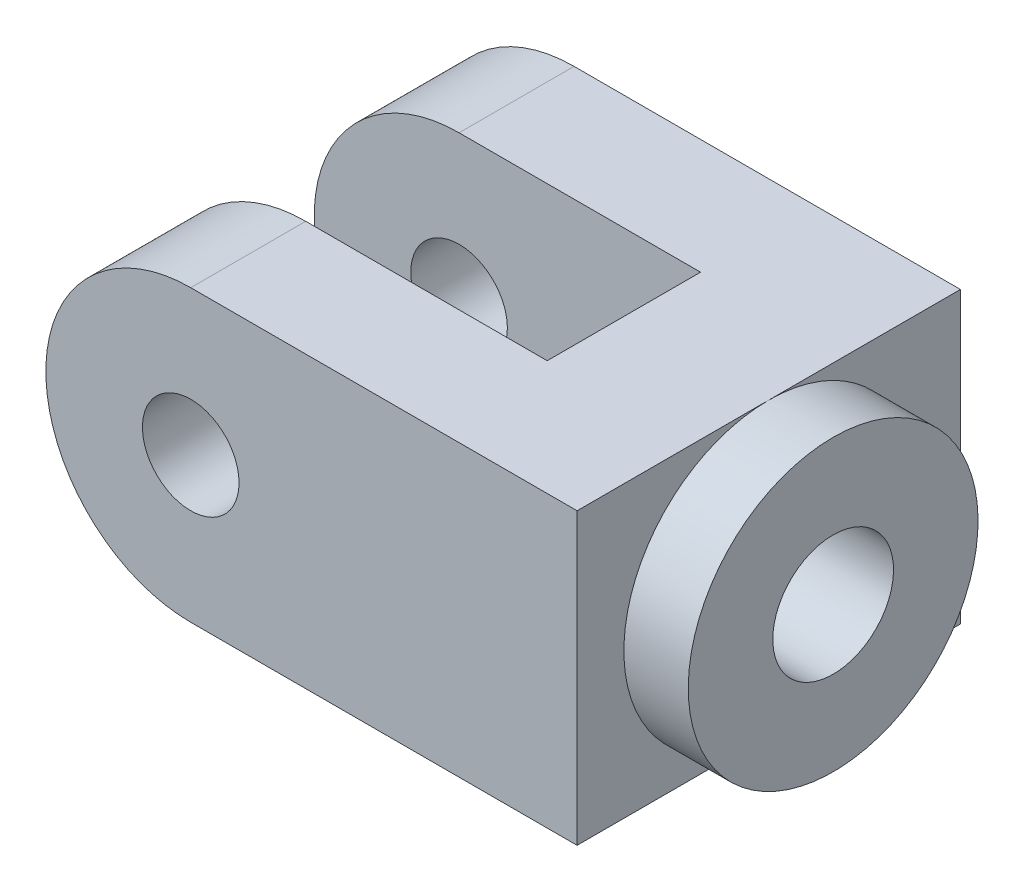
ISO-10303-21;
HEADER;
FILE_DESCRIPTION(('STEP AP214'),'2;1');
FILE_NAME('part.step','',(''),(''),'','','');
FILE_SCHEMA(('AUTOMOTIVE_DESIGN { 1 0 10303 214 1 1 1 1 }'));
ENDSEC;
DATA;
#1=APPLICATION_CONTEXT('core data for automotive mechanical design processes');
#2=APPLICATION_PROTOCOL_DEFINITION('international standard','automotive_design',2000,#1);
#3=PRODUCT_CONTEXT('',#1,'mechanical');
#4=PRODUCT('Part','Part','',(#3));
#5=PRODUCT_RELATED_PRODUCT_CATEGORY('part','',(#4));
#6=PRODUCT_DEFINITION_FORMATION('','',#4);
#7=PRODUCT_DEFINITION_CONTEXT('part definition',#1,'design');
#8=PRODUCT_DEFINITION('design','',#6,#7);
#9=PRODUCT_DEFINITION_SHAPE('','',#8);
#10=(LENGTH_UNIT() NAMED_UNIT(*) SI_UNIT(.MILLI.,.METRE.));
#11=(NAMED_UNIT(*) PLANE_ANGLE_UNIT() SI_UNIT($,.RADIAN.));
#12=(NAMED_UNIT(*) SI_UNIT($,.STERADIAN.) SOLID_ANGLE_UNIT());
#13=UNCERTAINTY_MEASURE_WITH_UNIT(LENGTH_MEASURE(1.E-05),#10,'distance_accuracy_value','');
#14=(GEOMETRIC_REPRESENTATION_CONTEXT(3) GLOBAL_UNCERTAINTY_ASSIGNED_CONTEXT((#13)) GLOBAL_UNIT_ASSIGNED_CONTEXT((#10,
#11,#12)) REPRESENTATION_CONTEXT('',''));
#15=CARTESIAN_POINT('',(0.,0.,0.));
#16=DIRECTION('',(0.,0.,1.));
#17=DIRECTION('',(1.,0.,0.));
#18=AXIS2_PLACEMENT_3D('',#15,#16,#17);
#19=CARTESIAN_POINT('',(33.8277041829736,12.5928,16.659225));
#20=DIRECTION('',(-1.,0.,0.));
#21=DIRECTION('',(0.,-1.,0.));
#22=AXIS2_PLACEMENT_3D('',#19,#20,#21);
#23=PLANE('',#22);
#24=CARTESIAN_POINT('',(33.8277041829736,0.,0.));
#25=DIRECTION('',(1.,0.,0.));
#26=DIRECTION('',(0.,1.,0.));
#27=AXIS2_PLACEMENT_3D('',#24,#25,#26);
#28=CIRCLE('',#27,12.5928);
#29=CARTESIAN_POINT('',(33.8277041829736,12.5928,0.));
#30=VERTEX_POINT('',#29);
#31=CARTESIAN_POINT('',(33.8277041829736,-12.5928,0.));
#32=VERTEX_POINT('',#31);
#33=EDGE_CURVE('E50',#30,#32,#28,.T.);
#34=ORIENTED_EDGE('',*,*,#33,.F.);
#35=DIRECTION('',(0.,0.,-1.));
#36=VECTOR('',#35,1.);
#37=CARTESIAN_POINT('',(33.8277041829736,12.5928,16.659225));
#38=LINE('',#37,#36);
#39=CARTESIAN_POINT('',(33.8277041829736,12.5928,16.659225));
#40=VERTEX_POINT('',#39);
#41=EDGE_CURVE('E112',#40,#30,#38,.T.);
#42=ORIENTED_EDGE('',*,*,#41,.F.);
#43=DIRECTION('',(0.,1.,0.));
#44=VECTOR('',#43,1.);
#45=CARTESIAN_POINT('',(33.8277041829736,12.5928,16.659225));
#46=LINE('',#45,#44);
#47=CARTESIAN_POINT('',(33.8277041829736,-12.5928,16.659225));
#48=VERTEX_POINT('',#47);
#49=EDGE_CURVE('E262',#48,#40,#46,.T.);
#50=ORIENTED_EDGE('',*,*,#49,.F.);
#51=DIRECTION('',(0.,0.,-1.));
#52=VECTOR('',#51,1.);
#53=CARTESIAN_POINT('',(33.8277041829736,-12.5928,16.659225));
#54=LINE('',#53,#52);
#55=EDGE_CURVE('E132',#48,#32,#54,.T.);
#56=ORIENTED_EDGE('',*,*,#55,.T.);
#57=EDGE_LOOP('',(#34,#42,#50,#56));
#58=FACE_BOUND('',#57,.T.);
#59=ADVANCED_FACE('F38',(#58),#23,.F.);
#60=CARTESIAN_POINT('',(0.246904182973619,0.,136.133565343694));
#61=DIRECTION('',(0.,0.,-1.));
#62=DIRECTION('',(-1.,0.,0.));
#63=AXIS2_PLACEMENT_3D('',#60,#61,#62);
#64=CYLINDRICAL_SURFACE('',#63,12.5928);
#65=DIRECTION('',(0.,0.,-1.));
#66=VECTOR('',#65,1.);
#67=CARTESIAN_POINT('',(0.246904182973616,12.5928,136.133565343694));
#68=LINE('',#67,#66);
#69=CARTESIAN_POINT('',(0.246904182973616,12.5928,16.659225));
#70=VERTEX_POINT('',#69);
#71=CARTESIAN_POINT('',(0.246904182973622,12.5928,6.66369));
#72=VERTEX_POINT('',#71);
#73=EDGE_CURVE('E256',#70,#72,#68,.T.);
#74=ORIENTED_EDGE('',*,*,#73,.T.);
#75=CARTESIAN_POINT('',(0.246904182973619,0.,6.66369));
#76=DIRECTION('',(0.,0.,1.));
#77=DIRECTION('',(1.,0.,0.));
#78=AXIS2_PLACEMENT_3D('',#75,#76,#77);
#79=CIRCLE('',#78,12.5928);
#80=CARTESIAN_POINT('',(0.24690348143056,-12.5928,6.66369));
#81=VERTEX_POINT('',#80);
#82=EDGE_CURVE('E48',#72,#81,#79,.T.);
#83=ORIENTED_EDGE('',*,*,#82,.T.);
#84=DIRECTION('',(0.,0.,-1.));
#85=VECTOR('',#84,1.);
#86=CARTESIAN_POINT('',(0.24690348143056,-12.5928,136.133565343694));
#87=LINE('',#86,#85);
#88=CARTESIAN_POINT('',(0.24690348143056,-12.5928,16.659225));
#89=VERTEX_POINT('',#88);
#90=EDGE_CURVE('E251',#89,#81,#87,.T.);
#91=ORIENTED_EDGE('',*,*,#90,.F.);
#92=CARTESIAN_POINT('',(0.246904182973619,0.,16.659225));
#93=DIRECTION('',(0.,0.,1.));
#94=DIRECTION('',(1.,0.,0.));
#95=AXIS2_PLACEMENT_3D('',#92,#93,#94);
#96=CIRCLE('',#95,12.5928);
#97=EDGE_CURVE('E254',#89,#70,#96,.F.);
#98=ORIENTED_EDGE('',*,*,#97,.T.);
#99=EDGE_LOOP('',(#74,#83,#91,#98));
#100=FACE_BOUND('',#99,.T.);
#101=ADVANCED_FACE('F159',(#100),#64,.T.);
#102=CARTESIAN_POINT('',(-12.3458958170264,-12.5928,16.659225));
#103=DIRECTION('',(0.,1.,0.));
#104=DIRECTION('',(0.,0.,1.));
#105=AXIS2_PLACEMENT_3D('',#102,#103,#104);
#106=PLANE('',#105);
#107=ORIENTED_EDGE('',*,*,#90,.T.);
#108=DIRECTION('',(1.,0.,0.));
#109=VECTOR('',#108,1.);
#110=CARTESIAN_POINT('',(-12.3458958170264,-12.5928,6.66369));
#111=LINE('',#110,#109);
#112=CARTESIAN_POINT('',(21.2349041829736,-12.5928,6.66369));
#113=VERTEX_POINT('',#112);
#114=EDGE_CURVE('E243',#81,#113,#111,.T.);
#115=ORIENTED_EDGE('',*,*,#114,.T.);
#116=DIRECTION('',(0.,0.,-1.));
#117=VECTOR('',#116,1.);
#118=CARTESIAN_POINT('',(21.2349041829736,-12.5928,16.659225));
#119=LINE('',#118,#117);
#120=CARTESIAN_POINT('',(21.2349041829736,-12.5928,-6.66369000000001));
#121=VERTEX_POINT('',#120);
#122=EDGE_CURVE('E247',#113,#121,#119,.T.);
#123=ORIENTED_EDGE('',*,*,#122,.T.);
#124=DIRECTION('',(-1.,0.,0.));
#125=VECTOR('',#124,1.);
#126=CARTESIAN_POINT('',(-12.3458958170264,-12.5928,-6.66369));
#127=LINE('',#126,#125);
#128=CARTESIAN_POINT('',(0.24690348143056,-12.5928,-6.66369000000001));
#129=VERTEX_POINT('',#128);
#130=EDGE_CURVE('E237',#121,#129,#127,.T.);
#131=ORIENTED_EDGE('',*,*,#130,.T.);
#132=CARTESIAN_POINT('',(0.24690348143056,-12.5928,-16.659225));
#133=VERTEX_POINT('',#132);
#134=EDGE_CURVE('E255',#129,#133,#87,.T.);
#135=ORIENTED_EDGE('',*,*,#134,.T.);
#136=DIRECTION('',(1.,0.,0.));
#137=VECTOR('',#136,1.);
#138=CARTESIAN_POINT('',(-12.3458958170264,-12.5928,-16.659225));
#139=LINE('',#138,#137);
#140=CARTESIAN_POINT('',(33.8277041829736,-12.5928,-16.659225));
#141=VERTEX_POINT('',#140);
#142=EDGE_CURVE('E265',#133,#141,#139,.T.);
#143=ORIENTED_EDGE('',*,*,#142,.T.);
#144=EDGE_CURVE('E271',#32,#141,#54,.T.);
#145=ORIENTED_EDGE('',*,*,#144,.F.);
#146=ORIENTED_EDGE('',*,*,#55,.F.);
#147=DIRECTION('',(1.,0.,0.));
#148=VECTOR('',#147,1.);
#149=CARTESIAN_POINT('',(-12.3458958170264,-12.5928,16.659225));
#150=LINE('',#149,#148);
#151=EDGE_CURVE('E268',#89,#48,#150,.T.);
#152=ORIENTED_EDGE('',*,*,#151,.F.);
#153=EDGE_LOOP('',(#107,#115,#123,#131,#135,#143,#145,#146,#152));
#154=FACE_BOUND('',#153,.T.);
#155=ADVANCED_FACE('F163',(#154),#106,.F.);
#156=EDGE_CURVE('E11',#32,#30,#28,.T.);
#157=ORIENTED_EDGE('',*,*,#156,.F.);
#158=ORIENTED_EDGE('',*,*,#144,.T.);
#159=DIRECTION('',(0.,1.,0.));
#160=VECTOR('',#159,1.);
#161=CARTESIAN_POINT('',(33.8277041829736,12.5928,-16.659225));
#162=LINE('',#161,#160);
#163=CARTESIAN_POINT('',(33.8277041829736,12.5928,-16.659225));
#164=VERTEX_POINT('',#163);
#165=EDGE_CURVE('E130',#141,#164,#162,.T.);
#166=ORIENTED_EDGE('',*,*,#165,.T.);
#167=EDGE_CURVE('E116',#30,#164,#38,.T.);
#168=ORIENTED_EDGE('',*,*,#167,.F.);
#169=EDGE_LOOP('',(#157,#158,#166,#168));
#170=FACE_BOUND('',#169,.T.);
#171=ADVANCED_FACE('F40',(#170),#23,.F.);
#172=CARTESIAN_POINT('',(-12.3458958170264,12.5928,16.659225));
#173=DIRECTION('',(0.,-1.,0.));
#174=DIRECTION('',(0.,0.,-1.));
#175=AXIS2_PLACEMENT_3D('',#172,#173,#174);
#176=PLANE('',#175);
#177=DIRECTION('',(0.,0.,-1.));
#178=VECTOR('',#177,1.);
#179=CARTESIAN_POINT('',(21.2349041829736,12.5928,-6.66369000000001));
#180=LINE('',#179,#178);
#181=CARTESIAN_POINT('',(21.2349041829736,12.5928,6.66369));
#182=VERTEX_POINT('',#181);
#183=CARTESIAN_POINT('',(21.2349041829736,12.5928,-6.66369000000001));
#184=VERTEX_POINT('',#183);
#185=EDGE_CURVE('E221',#182,#184,#180,.T.);
#186=ORIENTED_EDGE('',*,*,#185,.F.);
#187=DIRECTION('',(1.,0.,0.));
#188=VECTOR('',#187,1.);
#189=CARTESIAN_POINT('',(21.2349041829736,12.5928,6.66369));
#190=LINE('',#189,#188);
#191=EDGE_CURVE('E229',#72,#182,#190,.T.);
#192=ORIENTED_EDGE('',*,*,#191,.F.);
#193=ORIENTED_EDGE('',*,*,#73,.F.);
#194=DIRECTION('',(-1.,0.,0.));
#195=VECTOR('',#194,1.);
#196=CARTESIAN_POINT('',(-12.3458958170264,12.5928,16.659225));
#197=LINE('',#196,#195);
#198=EDGE_CURVE('E120',#40,#70,#197,.T.);
#199=ORIENTED_EDGE('',*,*,#198,.F.);
#200=ORIENTED_EDGE('',*,*,#41,.T.);
#201=ORIENTED_EDGE('',*,*,#167,.T.);
#202=DIRECTION('',(-1.,0.,0.));
#203=VECTOR('',#202,1.);
#204=CARTESIAN_POINT('',(-12.3458958170264,12.5928,-16.659225));
#205=LINE('',#204,#203);
#206=CARTESIAN_POINT('',(0.246904182973619,12.5928,-16.659225));
#207=VERTEX_POINT('',#206);
#208=EDGE_CURVE('E274',#164,#207,#205,.T.);
#209=ORIENTED_EDGE('',*,*,#208,.T.);
#210=CARTESIAN_POINT('',(0.246904182973623,12.5928,-6.66369));
#211=VERTEX_POINT('',#210);
#212=EDGE_CURVE('E63',#211,#207,#68,.T.);
#213=ORIENTED_EDGE('',*,*,#212,.F.);
#214=DIRECTION('',(-1.,0.,0.));
#215=VECTOR('',#214,1.);
#216=CARTESIAN_POINT('',(21.2349041829736,12.5928,-6.66369000000001));
#217=LINE('',#216,#215);
#218=EDGE_CURVE('E225',#184,#211,#217,.T.);
#219=ORIENTED_EDGE('',*,*,#218,.F.);
#220=EDGE_LOOP('',(#186,#192,#193,#199,#200,#201,#209,#213,#219));
#221=FACE_BOUND('',#220,.T.);
#222=ADVANCED_FACE('F114',(#221),#176,.F.);
#223=CARTESIAN_POINT('',(10.7409041829736,0.,16.659225));
#224=DIRECTION('',(0.,0.,1.));
#225=DIRECTION('',(1.,0.,0.));
#226=AXIS2_PLACEMENT_3D('',#223,#224,#225);
#227=PLANE('',#226);
#228=CARTESIAN_POINT('',(0.246904182973619,0.,16.659225));
#229=DIRECTION('',(0.,0.,1.));
#230=DIRECTION('',(1.,0.,0.));
#231=AXIS2_PLACEMENT_3D('',#228,#229,#230);
#232=CIRCLE('',#231,4.1976);
#233=CARTESIAN_POINT('',(4.44450418297362,0.,16.659225));
#234=VERTEX_POINT('',#233);
#235=EDGE_CURVE('E210',#234,#234,#232,.T.);
#236=ORIENTED_EDGE('',*,*,#235,.F.);
#237=EDGE_LOOP('',(#236));
#238=FACE_BOUND('',#237,.T.);
#239=ORIENTED_EDGE('',*,*,#97,.F.);
#240=ORIENTED_EDGE('',*,*,#151,.T.);
#241=ORIENTED_EDGE('',*,*,#49,.T.);
#242=ORIENTED_EDGE('',*,*,#198,.T.);
#243=EDGE_LOOP('',(#239,#240,#241,#242));
#244=FACE_BOUND('',#243,.T.);
#245=ADVANCED_FACE('F172',(#238,#244),#227,.T.);
#246=CARTESIAN_POINT('',(10.7409041829736,0.,-16.659225));
#247=DIRECTION('',(0.,0.,1.));
#248=DIRECTION('',(1.,0.,0.));
#249=AXIS2_PLACEMENT_3D('',#246,#247,#248);
#250=PLANE('',#249);
#251=CARTESIAN_POINT('',(0.246904182973619,0.,-16.659225));
#252=DIRECTION('',(0.,0.,1.));
#253=DIRECTION('',(1.,0.,0.));
#254=AXIS2_PLACEMENT_3D('',#251,#252,#253);
#255=CIRCLE('',#254,4.1976);
#256=CARTESIAN_POINT('',(4.44450418297362,0.,-16.659225));
#257=VERTEX_POINT('',#256);
#258=EDGE_CURVE('E309',#257,#257,#255,.T.);
#259=ORIENTED_EDGE('',*,*,#258,.T.);
#260=EDGE_LOOP('',(#259));
#261=FACE_BOUND('',#260,.T.);
#262=ORIENTED_EDGE('',*,*,#142,.F.);
#263=CARTESIAN_POINT('',(0.246904182973619,0.,-16.659225));
#264=DIRECTION('',(0.,0.,1.));
#265=DIRECTION('',(1.,0.,0.));
#266=AXIS2_PLACEMENT_3D('',#263,#264,#265);
#267=CIRCLE('',#266,12.5928);
#268=EDGE_CURVE('E126',#133,#207,#267,.F.);
#269=ORIENTED_EDGE('',*,*,#268,.T.);
#270=ORIENTED_EDGE('',*,*,#208,.F.);
#271=ORIENTED_EDGE('',*,*,#165,.F.);
#272=EDGE_LOOP('',(#262,#269,#270,#271));
#273=FACE_BOUND('',#272,.T.);
#274=ADVANCED_FACE('F179',(#261,#273),#250,.F.);
#275=CARTESIAN_POINT('',(0.246904182973619,0.,-6.66369000000001));
#276=DIRECTION('',(0.,0.,-1.));
#277=DIRECTION('',(-1.,0.,0.));
#278=AXIS2_PLACEMENT_3D('',#275,#276,#277);
#279=CIRCLE('',#278,12.5928);
#280=EDGE_CURVE('E284',#129,#211,#279,.T.);
#281=ORIENTED_EDGE('',*,*,#280,.T.);
#282=ORIENTED_EDGE('',*,*,#212,.T.);
#283=ORIENTED_EDGE('',*,*,#268,.F.);
#284=ORIENTED_EDGE('',*,*,#134,.F.);
#285=EDGE_LOOP('',(#281,#282,#283,#284));
#286=FACE_BOUND('',#285,.T.);
#287=ADVANCED_FACE('F166',(#286),#64,.T.);
#288=CARTESIAN_POINT('',(21.2349041829736,-17.22765,-6.66369000000001));
#289=DIRECTION('',(1.,0.,0.));
#290=DIRECTION('',(0.,0.,-1.));
#291=AXIS2_PLACEMENT_3D('',#288,#289,#290);
#292=PLANE('',#291);
#293=CARTESIAN_POINT('',(21.2349041829736,0.,0.));
#294=DIRECTION('',(1.,0.,0.));
#295=DIRECTION('',(0.,0.,-1.));
#296=AXIS2_PLACEMENT_3D('',#293,#294,#295);
#297=CIRCLE('',#296,5.247);
#298=CARTESIAN_POINT('',(21.2349041829736,5.247,0.));
#299=VERTEX_POINT('',#298);
#300=EDGE_CURVE('E205',#299,#299,#297,.T.);
#301=ORIENTED_EDGE('',*,*,#300,.T.);
#302=EDGE_LOOP('',(#301));
#303=FACE_BOUND('',#302,.T.);
#304=DIRECTION('',(0.,1.,0.));
#305=VECTOR('',#304,1.);
#306=CARTESIAN_POINT('',(21.2349041829736,-17.22765,6.66369));
#307=LINE('',#306,#305);
#308=EDGE_CURVE('E234',#113,#182,#307,.T.);
#309=ORIENTED_EDGE('',*,*,#308,.T.);
#310=ORIENTED_EDGE('',*,*,#185,.T.);
#311=DIRECTION('',(0.,1.,0.));
#312=VECTOR('',#311,1.);
#313=CARTESIAN_POINT('',(21.2349041829736,-17.22765,-6.66369000000001));
#314=LINE('',#313,#312);
#315=EDGE_CURVE('E233',#121,#184,#314,.T.);
#316=ORIENTED_EDGE('',*,*,#315,.F.);
#317=ORIENTED_EDGE('',*,*,#122,.F.);
#318=EDGE_LOOP('',(#309,#310,#316,#317));
#319=FACE_BOUND('',#318,.T.);
#320=ADVANCED_FACE('F187',(#303,#319),#292,.F.);
#321=CARTESIAN_POINT('',(21.2349041829736,-17.22765,6.66369));
#322=DIRECTION('',(0.,0.,1.));
#323=DIRECTION('',(1.,0.,0.));
#324=AXIS2_PLACEMENT_3D('',#321,#322,#323);
#325=PLANE('',#324);
#326=CARTESIAN_POINT('',(0.246904182973619,0.,6.66368999999999));
#327=DIRECTION('',(0.,0.,1.));
#328=DIRECTION('',(1.,0.,0.));
#329=AXIS2_PLACEMENT_3D('',#326,#327,#328);
#330=CIRCLE('',#329,4.1976);
#331=CARTESIAN_POINT('',(4.44450418297362,0.,6.66368999999999));
#332=VERTEX_POINT('',#331);
#333=EDGE_CURVE('E214',#332,#332,#330,.T.);
#334=ORIENTED_EDGE('',*,*,#333,.T.);
#335=EDGE_LOOP('',(#334));
#336=FACE_BOUND('',#335,.T.);
#337=ORIENTED_EDGE('',*,*,#82,.F.);
#338=ORIENTED_EDGE('',*,*,#191,.T.);
#339=ORIENTED_EDGE('',*,*,#308,.F.);
#340=ORIENTED_EDGE('',*,*,#114,.F.);
#341=EDGE_LOOP('',(#337,#338,#339,#340));
#342=FACE_BOUND('',#341,.T.);
#343=ADVANCED_FACE('F190',(#336,#342),#325,.F.);
#344=CARTESIAN_POINT('',(21.2349041829736,-17.22765,-6.66369000000001));
#345=DIRECTION('',(0.,0.,-1.));
#346=DIRECTION('',(-1.,0.,0.));
#347=AXIS2_PLACEMENT_3D('',#344,#345,#346);
#348=PLANE('',#347);
#349=CARTESIAN_POINT('',(0.246904182973619,0.,-6.66369));
#350=DIRECTION('',(0.,0.,-1.));
#351=DIRECTION('',(-1.,0.,0.));
#352=AXIS2_PLACEMENT_3D('',#349,#350,#351);
#353=CIRCLE('',#352,4.1976);
#354=CARTESIAN_POINT('',(-3.95069581702638,0.,-6.66369));
#355=VERTEX_POINT('',#354);
#356=EDGE_CURVE('E42',#355,#355,#353,.T.);
#357=ORIENTED_EDGE('',*,*,#356,.T.);
#358=EDGE_LOOP('',(#357));
#359=FACE_BOUND('',#358,.T.);
#360=ORIENTED_EDGE('',*,*,#315,.T.);
#361=ORIENTED_EDGE('',*,*,#218,.T.);
#362=ORIENTED_EDGE('',*,*,#280,.F.);
#363=ORIENTED_EDGE('',*,*,#130,.F.);
#364=EDGE_LOOP('',(#360,#361,#362,#363));
#365=FACE_BOUND('',#364,.T.);
#366=ADVANCED_FACE('F192',(#359,#365),#348,.F.);
#367=CARTESIAN_POINT('',(4.00725418297362,0.,0.));
#368=DIRECTION('',(1.,0.,0.));
#369=DIRECTION('',(0.,1.,0.));
#370=AXIS2_PLACEMENT_3D('',#367,#368,#369);
#371=CYLINDRICAL_SURFACE('',#370,5.247);
#372=CARTESIAN_POINT('',(39.4245041829736,0.,0.));
#373=DIRECTION('',(1.,0.,0.));
#374=DIRECTION('',(0.,1.,0.));
#375=AXIS2_PLACEMENT_3D('',#372,#373,#374);
#376=CIRCLE('',#375,5.247);
#377=CARTESIAN_POINT('',(39.4245041829736,5.24700000000001,0.));
#378=VERTEX_POINT('',#377);
#379=EDGE_CURVE('E139',#378,#378,#376,.T.);
#380=CARTESIAN_POINT('',(21.2349041829736,5.247,0.));
#381=CARTESIAN_POINT('',(21.4243791829736,5.247,0.));
#382=CARTESIAN_POINT('',(21.6138541829736,5.247,0.));
#383=CARTESIAN_POINT('',(21.9928041829736,5.247,0.));
#384=CARTESIAN_POINT('',(22.1822791829736,5.247,0.));
#385=CARTESIAN_POINT('',(22.5612291829736,5.247,0.));
#386=CARTESIAN_POINT('',(22.7507041829736,5.247,0.));
#387=CARTESIAN_POINT('',(23.1296541829736,5.247,0.));
#388=CARTESIAN_POINT('',(23.3191291829736,5.247,0.));
#389=CARTESIAN_POINT('',(23.6980791829736,5.247,0.));
#390=CARTESIAN_POINT('',(23.8875541829736,5.247,0.));
#391=CARTESIAN_POINT('',(24.2665041829736,5.247,0.));
#392=CARTESIAN_POINT('',(24.4559791829736,5.247,0.));
#393=CARTESIAN_POINT('',(24.8349291829736,5.247,0.));
#394=CARTESIAN_POINT('',(25.0244041829736,5.247,0.));
#395=CARTESIAN_POINT('',(25.4033541829736,5.247,0.));
#396=CARTESIAN_POINT('',(25.5928291829736,5.247,0.));
#397=CARTESIAN_POINT('',(25.9717791829736,5.247,0.));
#398=CARTESIAN_POINT('',(26.1612541829736,5.247,0.));
#399=CARTESIAN_POINT('',(26.5402041829736,5.247,0.));
#400=CARTESIAN_POINT('',(26.7296791829736,5.247,0.));
#401=CARTESIAN_POINT('',(27.1086291829736,5.247,0.));
#402=CARTESIAN_POINT('',(27.2981041829736,5.247,0.));
#403=CARTESIAN_POINT('',(27.6770541829736,5.247,0.));
#404=CARTESIAN_POINT('',(27.8665291829736,5.24700000000001,0.));
#405=CARTESIAN_POINT('',(28.2454791829736,5.24700000000001,0.));
#406=CARTESIAN_POINT('',(28.4349541829736,5.24700000000001,0.));
#407=CARTESIAN_POINT('',(28.8139041829736,5.24700000000001,0.));
#408=CARTESIAN_POINT('',(29.0033791829736,5.24700000000001,0.));
#409=CARTESIAN_POINT('',(29.3823291829736,5.24700000000001,0.));
#410=CARTESIAN_POINT('',(29.5718041829736,5.24700000000001,0.));
#411=CARTESIAN_POINT('',(29.9507541829736,5.24700000000001,0.));
#412=CARTESIAN_POINT('',(30.1402291829736,5.24700000000001,0.));
#413=CARTESIAN_POINT('',(30.5191791829736,5.24700000000001,0.));
#414=CARTESIAN_POINT('',(30.7086541829736,5.24700000000001,0.));
#415=CARTESIAN_POINT('',(31.0876041829736,5.24700000000001,0.));
#416=CARTESIAN_POINT('',(31.2770791829736,5.24700000000001,0.));
#417=CARTESIAN_POINT('',(31.6560291829736,5.24700000000001,0.));
#418=CARTESIAN_POINT('',(31.8455041829736,5.24700000000001,0.));
#419=CARTESIAN_POINT('',(32.2244541829736,5.24700000000001,0.));
#420=CARTESIAN_POINT('',(32.4139291829736,5.24700000000001,0.));
#421=CARTESIAN_POINT('',(32.7928791829736,5.24700000000001,0.));
#422=CARTESIAN_POINT('',(32.9823541829736,5.24700000000001,0.));
#423=CARTESIAN_POINT('',(33.3613041829736,5.24700000000001,0.));
#424=CARTESIAN_POINT('',(33.5507791829736,5.24700000000001,0.));
#425=CARTESIAN_POINT('',(33.9297291829736,5.24700000000001,0.));
#426=CARTESIAN_POINT('',(34.1192041829736,5.24700000000001,0.));
#427=CARTESIAN_POINT('',(34.4981541829736,5.24700000000001,0.));
#428=CARTESIAN_POINT('',(34.6876291829736,5.24700000000001,0.));
#429=CARTESIAN_POINT('',(35.0665791829736,5.24700000000001,0.));
#430=CARTESIAN_POINT('',(35.2560541829736,5.24700000000001,0.));
#431=CARTESIAN_POINT('',(35.6350041829736,5.24700000000001,0.));
#432=CARTESIAN_POINT('',(35.8244791829736,5.24700000000001,0.));
#433=CARTESIAN_POINT('',(36.2034291829736,5.24700000000001,0.));
#434=CARTESIAN_POINT('',(36.3929041829736,5.24700000000001,0.));
#435=CARTESIAN_POINT('',(36.7718541829736,5.24700000000001,0.));
#436=CARTESIAN_POINT('',(36.9613291829736,5.24700000000001,0.));
#437=CARTESIAN_POINT('',(37.3402791829736,5.24700000000001,0.));
#438=CARTESIAN_POINT('',(37.5297541829736,5.24700000000001,0.));
#439=CARTESIAN_POINT('',(37.9087041829736,5.24700000000001,0.));
#440=CARTESIAN_POINT('',(38.0981791829736,5.24700000000001,0.));
#441=CARTESIAN_POINT('',(38.4771291829736,5.24700000000001,0.));
#442=CARTESIAN_POINT('',(38.6666041829736,5.24700000000001,0.));
#443=CARTESIAN_POINT('',(39.0455541829736,5.24700000000001,0.));
#444=CARTESIAN_POINT('',(39.2350291829736,5.24700000000001,0.));
#445=CARTESIAN_POINT('',(39.4245041829736,5.24700000000001,0.));
#446=B_SPLINE_CURVE_WITH_KNOTS('',3,(#380,#381,#382,#383,#384,#385,#386,#387,#388,#389,#390,
#391,#392,#393,#394,#395,#396,#397,#398,#399,#400,#401,#402,#403,#404,#405,#406,#407,#408,#409,
#410,#411,#412,#413,#414,#415,#416,#417,#418,#419,#420,#421,#422,#423,#424,#425,#426,#427,#428,
#429,#430,#431,#432,#433,#434,#435,#436,#437,#438,#439,#440,#441,#442,#443,#444,#445),
.UNSPECIFIED.,.F.,.F.,(4,2,2,2,2,2,2,2,2,2,2,2,2,2,2,2,2,2,2,2,2,2,2,2,2,2,2,2,2,2,2,2,4),(0.,
0.568425000000004,1.13685,1.70527500000001,2.2737,2.84212500000001,3.41055000000001,3.978975,
4.54740000000001,5.115825,5.68425000000001,6.25267500000001,6.82110000000001,7.38952500000001,
7.95795000000001,8.52637500000001,9.09480000000001,9.66322500000001,10.23165,10.800075,11.3685,
11.936925,12.50535,13.073775,13.6422,14.210625,14.77905,15.347475,15.9159,16.484325,17.05275,
17.621175,18.1896),.UNSPECIFIED.);
#447=EDGE_CURVE('BSEAM153',#299,#378,#446,.T.);
#448=ORIENTED_EDGE('',*,*,#300,.F.);
#449=ORIENTED_EDGE('',*,*,#379,.T.);
#450=ORIENTED_EDGE('',*,*,#447,.T.);
#451=ORIENTED_EDGE('',*,*,#447,.F.);
#452=EDGE_LOOP('',(#448,#450,#449,#451));
#453=FACE_BOUND('',#452,.T.);
#454=ADVANCED_FACE('F153',(#453),#371,.F.);
#455=CARTESIAN_POINT('',(39.4245041829736,0.,0.));
#456=DIRECTION('',(1.,0.,0.));
#457=DIRECTION('',(0.,1.,0.));
#458=AXIS2_PLACEMENT_3D('',#455,#456,#457);
#459=PLANE('',#458);
#460=CARTESIAN_POINT('',(39.4245041829736,0.,0.));
#461=DIRECTION('',(1.,0.,0.));
#462=DIRECTION('',(0.,1.,0.));
#463=AXIS2_PLACEMENT_3D('',#460,#461,#462);
#464=CIRCLE('',#463,12.5928);
#465=CARTESIAN_POINT('',(39.4245041829736,12.5928,0.));
#466=VERTEX_POINT('',#465);
#467=EDGE_CURVE('E138',#466,#466,#464,.T.);
#468=ORIENTED_EDGE('',*,*,#467,.T.);
#469=EDGE_LOOP('',(#468));
#470=FACE_BOUND('',#469,.T.);
#471=ORIENTED_EDGE('',*,*,#379,.F.);
#472=EDGE_LOOP('',(#471));
#473=FACE_BOUND('',#472,.T.);
#474=ADVANCED_FACE('F143',(#470,#473),#459,.T.);
#475=CARTESIAN_POINT('',(39.4245041829736,0.,0.));
#476=DIRECTION('',(-1.,0.,0.));
#477=DIRECTION('',(0.,-1.,0.));
#478=AXIS2_PLACEMENT_3D('',#475,#476,#477);
#479=CYLINDRICAL_SURFACE('',#478,12.5928);
#480=ORIENTED_EDGE('',*,*,#467,.F.);
#481=EDGE_LOOP('',(#480));
#482=FACE_BOUND('',#481,.T.);
#483=ORIENTED_EDGE('',*,*,#33,.T.);
#484=ORIENTED_EDGE('',*,*,#156,.T.);
#485=EDGE_LOOP('',(#483,#484));
#486=FACE_BOUND('',#485,.T.);
#487=ADVANCED_FACE('F140',(#482,#486),#479,.T.);
#488=CARTESIAN_POINT('',(0.246904182973619,0.,-16.659225));
#489=DIRECTION('',(0.,0.,1.));
#490=DIRECTION('',(1.,0.,0.));
#491=AXIS2_PLACEMENT_3D('',#488,#489,#490);
#492=CYLINDRICAL_SURFACE('',#491,4.1976);
#493=ORIENTED_EDGE('',*,*,#258,.F.);
#494=EDGE_LOOP('',(#493));
#495=FACE_BOUND('',#494,.T.);
#496=ORIENTED_EDGE('',*,*,#356,.F.);
#497=EDGE_LOOP('',(#496));
#498=FACE_BOUND('',#497,.T.);
#499=ADVANCED_FACE('F142',(#495,#498),#492,.F.);
#500=ORIENTED_EDGE('',*,*,#235,.T.);
#501=EDGE_LOOP('',(#500));
#502=FACE_BOUND('',#501,.T.);
#503=ORIENTED_EDGE('',*,*,#333,.F.);
#504=EDGE_LOOP('',(#503));
#505=FACE_BOUND('',#504,.T.);
#506=ADVANCED_FACE('F150',(#502,#505),#492,.F.);
#507=CLOSED_SHELL('',(#59,#101,#155,#171,#222,#245,#274,#287,#320,#343,#366,#454,#474,#487,#499,#506));
#508=MANIFOLD_SOLID_BREP('B2',#507);
#509=ADVANCED_BREP_SHAPE_REPRESENTATION('',(#18,#508),#14);
#510=SHAPE_DEFINITION_REPRESENTATION(#9,#509);
ENDSEC;
END-ISO-10303-21;
